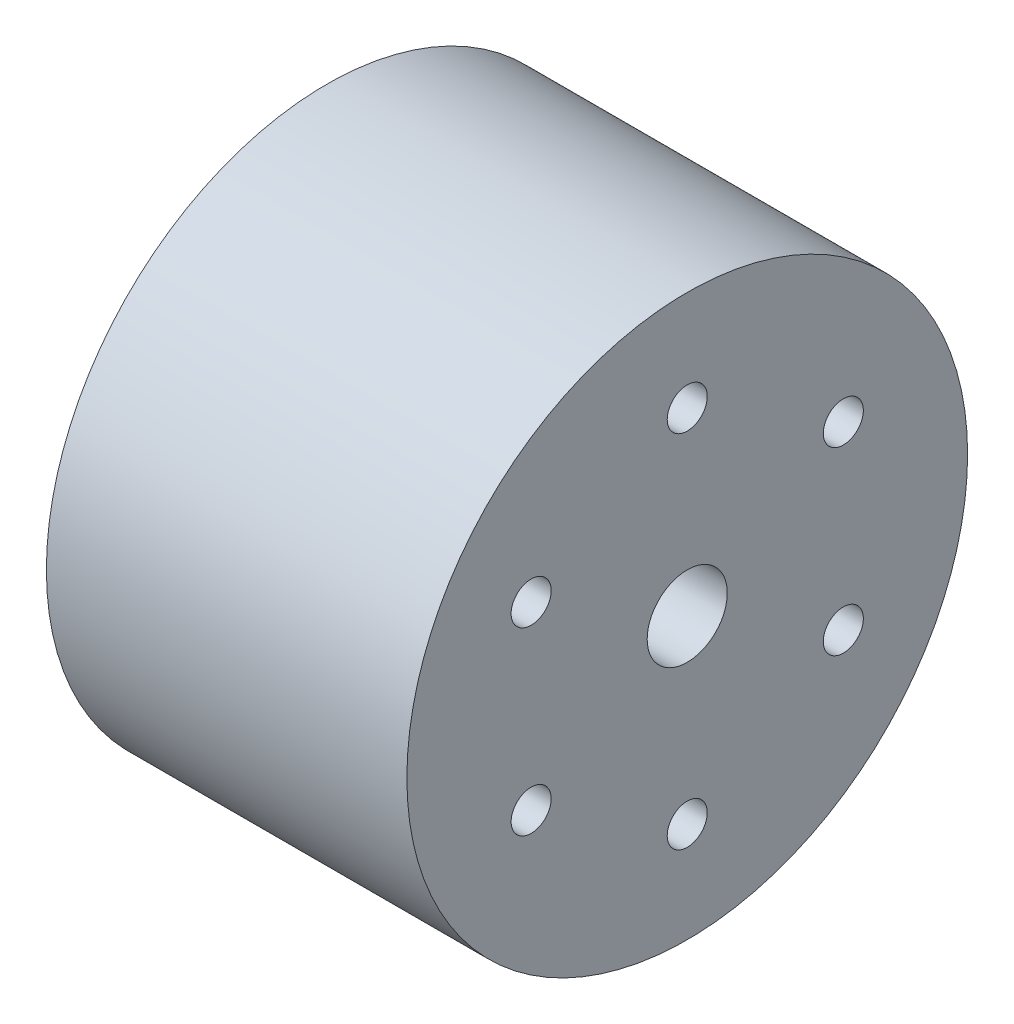
ISO-10303-21;
HEADER;
FILE_DESCRIPTION(('STEP AP214'),'2;1');
FILE_NAME('part.step','',(''),(''),'','','');
FILE_SCHEMA(('AUTOMOTIVE_DESIGN { 1 0 10303 214 1 1 1 1 }'));
ENDSEC;
DATA;
#1=APPLICATION_CONTEXT('core data for automotive mechanical design processes');
#2=APPLICATION_PROTOCOL_DEFINITION('international standard','automotive_design',2000,#1);
#3=PRODUCT_CONTEXT('',#1,'mechanical');
#4=PRODUCT('Part','Part','',(#3));
#5=PRODUCT_RELATED_PRODUCT_CATEGORY('part','',(#4));
#6=PRODUCT_DEFINITION_FORMATION('','',#4);
#7=PRODUCT_DEFINITION_CONTEXT('part definition',#1,'design');
#8=PRODUCT_DEFINITION('design','',#6,#7);
#9=PRODUCT_DEFINITION_SHAPE('','',#8);
#10=(LENGTH_UNIT() NAMED_UNIT(*) SI_UNIT(.MILLI.,.METRE.));
#11=(NAMED_UNIT(*) PLANE_ANGLE_UNIT() SI_UNIT($,.RADIAN.));
#12=(NAMED_UNIT(*) SI_UNIT($,.STERADIAN.) SOLID_ANGLE_UNIT());
#13=UNCERTAINTY_MEASURE_WITH_UNIT(LENGTH_MEASURE(1.E-05),#10,'distance_accuracy_value','');
#14=(GEOMETRIC_REPRESENTATION_CONTEXT(3) GLOBAL_UNCERTAINTY_ASSIGNED_CONTEXT((#13)) GLOBAL_UNIT_ASSIGNED_CONTEXT((#10,
#11,#12)) REPRESENTATION_CONTEXT('',''));
#15=CARTESIAN_POINT('',(0.,0.,0.));
#16=DIRECTION('',(0.,0.,1.));
#17=DIRECTION('',(1.,0.,0.));
#18=AXIS2_PLACEMENT_3D('',#15,#16,#17);
#19=CARTESIAN_POINT('',(0.,0.,0.));
#20=DIRECTION('',(-1.,0.,0.));
#21=DIRECTION('',(0.,0.,1.));
#22=AXIS2_PLACEMENT_3D('',#19,#20,#21);
#23=CYLINDRICAL_SURFACE('',#22,35.);
#24=CARTESIAN_POINT('',(14.45,0.,0.));
#25=DIRECTION('',(-1.,0.,0.));
#26=DIRECTION('',(0.,0.,1.));
#27=AXIS2_PLACEMENT_3D('',#24,#25,#26);
#28=CIRCLE('',#27,35.);
#29=CARTESIAN_POINT('',(14.45,0.,35.));
#30=VERTEX_POINT('',#29);
#31=EDGE_CURVE('E10',#30,#30,#28,.T.);
#32=ORIENTED_EDGE('',*,*,#31,.F.);
#33=EDGE_LOOP('',(#32));
#34=FACE_BOUND('',#33,.T.);
#35=CARTESIAN_POINT('',(59.45,0.,0.));
#36=DIRECTION('',(-1.,0.,0.));
#37=DIRECTION('',(0.,0.,1.));
#38=AXIS2_PLACEMENT_3D('',#35,#36,#37);
#39=CIRCLE('',#38,35.);
#40=CARTESIAN_POINT('',(59.45,0.,35.));
#41=VERTEX_POINT('',#40);
#42=EDGE_CURVE('E55',#41,#41,#39,.T.);
#43=ORIENTED_EDGE('',*,*,#42,.T.);
#44=EDGE_LOOP('',(#43));
#45=FACE_BOUND('',#44,.T.);
#46=ADVANCED_FACE('F33',(#34,#45),#23,.T.);
#47=CARTESIAN_POINT('',(14.45,35.,0.));
#48=DIRECTION('',(1.,0.,0.));
#49=DIRECTION('',(0.,0.,-1.));
#50=AXIS2_PLACEMENT_3D('',#47,#48,#49);
#51=PLANE('',#50);
#52=CARTESIAN_POINT('',(14.45,22.5,-2.65412691824451E-13));
#53=DIRECTION('',(-1.,0.,0.));
#54=DIRECTION('',(0.,0.,1.));
#55=AXIS2_PLACEMENT_3D('',#52,#53,#54);
#56=CIRCLE('',#55,2.5);
#57=CARTESIAN_POINT('',(14.45,22.5,2.49999999999973));
#58=VERTEX_POINT('',#57);
#59=EDGE_CURVE('E69',#58,#58,#56,.T.);
#60=ORIENTED_EDGE('',*,*,#59,.F.);
#61=EDGE_LOOP('',(#60));
#62=FACE_BOUND('',#61,.T.);
#63=CARTESIAN_POINT('',(14.45,11.2499999999998,-19.48557158515));
#64=DIRECTION('',(-1.,0.,0.));
#65=DIRECTION('',(0.,0.,1.));
#66=AXIS2_PLACEMENT_3D('',#63,#64,#65);
#67=CIRCLE('',#66,2.5);
#68=CARTESIAN_POINT('',(14.45,11.2499999999998,-16.98557158515));
#69=VERTEX_POINT('',#68);
#70=EDGE_CURVE('E68',#69,#69,#67,.T.);
#71=ORIENTED_EDGE('',*,*,#70,.F.);
#72=EDGE_LOOP('',(#71));
#73=FACE_BOUND('',#72,.T.);
#74=CARTESIAN_POINT('',(14.45,-11.2500000000002,-19.4855715851497));
#75=DIRECTION('',(-1.,0.,0.));
#76=DIRECTION('',(0.,0.,1.));
#77=AXIS2_PLACEMENT_3D('',#74,#75,#76);
#78=CIRCLE('',#77,2.5);
#79=CARTESIAN_POINT('',(14.45,-11.2500000000002,-16.9855715851497));
#80=VERTEX_POINT('',#79);
#81=EDGE_CURVE('E75',#80,#80,#78,.T.);
#82=ORIENTED_EDGE('',*,*,#81,.F.);
#83=EDGE_LOOP('',(#82));
#84=FACE_BOUND('',#83,.T.);
#85=CARTESIAN_POINT('',(14.45,-22.5,2.55004350968591E-13));
#86=DIRECTION('',(-1.,0.,0.));
#87=DIRECTION('',(0.,0.,1.));
#88=AXIS2_PLACEMENT_3D('',#85,#86,#87);
#89=CIRCLE('',#88,2.5);
#90=CARTESIAN_POINT('',(14.45,-22.5,2.50000000000025));
#91=VERTEX_POINT('',#90);
#92=EDGE_CURVE('E81',#91,#91,#89,.T.);
#93=ORIENTED_EDGE('',*,*,#92,.F.);
#94=EDGE_LOOP('',(#93));
#95=FACE_BOUND('',#94,.T.);
#96=CARTESIAN_POINT('',(14.45,-11.2499999999998,19.48557158515));
#97=DIRECTION('',(-1.,0.,0.));
#98=DIRECTION('',(0.,0.,1.));
#99=AXIS2_PLACEMENT_3D('',#96,#97,#98);
#100=CIRCLE('',#99,2.5);
#101=CARTESIAN_POINT('',(14.45,-11.2499999999998,21.98557158515));
#102=VERTEX_POINT('',#101);
#103=EDGE_CURVE('E87',#102,#102,#100,.T.);
#104=ORIENTED_EDGE('',*,*,#103,.F.);
#105=EDGE_LOOP('',(#104));
#106=FACE_BOUND('',#105,.T.);
#107=CARTESIAN_POINT('',(14.45,11.2500000000002,19.4855715851497));
#108=DIRECTION('',(-1.,0.,0.));
#109=DIRECTION('',(0.,0.,1.));
#110=AXIS2_PLACEMENT_3D('',#107,#108,#109);
#111=CIRCLE('',#110,2.5);
#112=CARTESIAN_POINT('',(14.45,11.2500000000002,21.9855715851497));
#113=VERTEX_POINT('',#112);
#114=EDGE_CURVE('E61',#113,#113,#111,.T.);
#115=ORIENTED_EDGE('',*,*,#114,.F.);
#116=EDGE_LOOP('',(#115));
#117=FACE_BOUND('',#116,.T.);
#118=CARTESIAN_POINT('',(14.45,0.,0.));
#119=DIRECTION('',(-1.,0.,0.));
#120=DIRECTION('',(0.,0.,1.));
#121=AXIS2_PLACEMENT_3D('',#118,#119,#120);
#122=CIRCLE('',#121,16.);
#123=CARTESIAN_POINT('',(14.45,0.,16.));
#124=VERTEX_POINT('',#123);
#125=EDGE_CURVE('E39',#124,#124,#122,.T.);
#126=ORIENTED_EDGE('',*,*,#125,.F.);
#127=EDGE_LOOP('',(#126));
#128=FACE_BOUND('',#127,.T.);
#129=ORIENTED_EDGE('',*,*,#31,.T.);
#130=EDGE_LOOP('',(#129));
#131=FACE_BOUND('',#130,.T.);
#132=ADVANCED_FACE('F97',(#62,#73,#84,#95,#106,#117,#128,#131),#51,.F.);
#133=CARTESIAN_POINT('',(0.,0.,0.));
#134=DIRECTION('',(-1.,0.,0.));
#135=DIRECTION('',(0.,0.,1.));
#136=AXIS2_PLACEMENT_3D('',#133,#134,#135);
#137=CYLINDRICAL_SURFACE('',#136,16.);
#138=CARTESIAN_POINT('',(19.45,0.,0.));
#139=DIRECTION('',(-1.,0.,0.));
#140=DIRECTION('',(0.,0.,1.));
#141=AXIS2_PLACEMENT_3D('',#138,#139,#140);
#142=CIRCLE('',#141,16.);
#143=CARTESIAN_POINT('',(19.45,0.,16.));
#144=VERTEX_POINT('',#143);
#145=EDGE_CURVE('E43',#144,#144,#142,.T.);
#146=ORIENTED_EDGE('',*,*,#145,.F.);
#147=EDGE_LOOP('',(#146));
#148=FACE_BOUND('',#147,.T.);
#149=ORIENTED_EDGE('',*,*,#125,.T.);
#150=EDGE_LOOP('',(#149));
#151=FACE_BOUND('',#150,.T.);
#152=ADVANCED_FACE('F100',(#148,#151),#137,.F.);
#153=CARTESIAN_POINT('',(19.45,16.,0.));
#154=DIRECTION('',(1.,0.,0.));
#155=DIRECTION('',(0.,0.,-1.));
#156=AXIS2_PLACEMENT_3D('',#153,#154,#155);
#157=PLANE('',#156);
#158=CARTESIAN_POINT('',(19.45,0.,0.));
#159=DIRECTION('',(-1.,0.,0.));
#160=DIRECTION('',(0.,0.,1.));
#161=AXIS2_PLACEMENT_3D('',#158,#159,#160);
#162=CIRCLE('',#161,5.);
#163=CARTESIAN_POINT('',(19.45,0.,5.));
#164=VERTEX_POINT('',#163);
#165=EDGE_CURVE('E47',#164,#164,#162,.T.);
#166=ORIENTED_EDGE('',*,*,#165,.F.);
#167=EDGE_LOOP('',(#166));
#168=FACE_BOUND('',#167,.T.);
#169=ORIENTED_EDGE('',*,*,#145,.T.);
#170=EDGE_LOOP('',(#169));
#171=FACE_BOUND('',#170,.T.);
#172=ADVANCED_FACE('F133',(#168,#171),#157,.F.);
#173=CARTESIAN_POINT('',(0.,0.,0.));
#174=DIRECTION('',(-1.,0.,0.));
#175=DIRECTION('',(0.,0.,1.));
#176=AXIS2_PLACEMENT_3D('',#173,#174,#175);
#177=CYLINDRICAL_SURFACE('',#176,5.);
#178=CARTESIAN_POINT('',(59.45,0.,0.));
#179=DIRECTION('',(-1.,0.,0.));
#180=DIRECTION('',(0.,0.,1.));
#181=AXIS2_PLACEMENT_3D('',#178,#179,#180);
#182=CIRCLE('',#181,5.);
#183=CARTESIAN_POINT('',(59.45,0.,5.));
#184=VERTEX_POINT('',#183);
#185=EDGE_CURVE('E52',#184,#184,#182,.T.);
#186=ORIENTED_EDGE('',*,*,#185,.F.);
#187=EDGE_LOOP('',(#186));
#188=FACE_BOUND('',#187,.T.);
#189=ORIENTED_EDGE('',*,*,#165,.T.);
#190=EDGE_LOOP('',(#189));
#191=FACE_BOUND('',#190,.T.);
#192=ADVANCED_FACE('F117',(#188,#191),#177,.F.);
#193=CARTESIAN_POINT('',(59.45,5.,0.));
#194=DIRECTION('',(-1.,0.,0.));
#195=DIRECTION('',(0.,0.,1.));
#196=AXIS2_PLACEMENT_3D('',#193,#194,#195);
#197=PLANE('',#196);
#198=CARTESIAN_POINT('',(59.45,22.5,-2.65412691824451E-13));
#199=DIRECTION('',(-1.,0.,0.));
#200=DIRECTION('',(0.,0.,1.));
#201=AXIS2_PLACEMENT_3D('',#198,#199,#200);
#202=CIRCLE('',#201,2.5);
#203=CARTESIAN_POINT('',(59.45,22.5,2.49999999999973));
#204=VERTEX_POINT('',#203);
#205=EDGE_CURVE('E65',#204,#204,#202,.F.);
#206=ORIENTED_EDGE('',*,*,#205,.F.);
#207=EDGE_LOOP('',(#206));
#208=FACE_BOUND('',#207,.T.);
#209=CARTESIAN_POINT('',(59.45,11.2499999999998,-19.48557158515));
#210=DIRECTION('',(-1.,0.,0.));
#211=DIRECTION('',(0.,0.,1.));
#212=AXIS2_PLACEMENT_3D('',#209,#210,#211);
#213=CIRCLE('',#212,2.5);
#214=CARTESIAN_POINT('',(59.45,11.2499999999998,-16.98557158515));
#215=VERTEX_POINT('',#214);
#216=EDGE_CURVE('E72',#215,#215,#213,.F.);
#217=ORIENTED_EDGE('',*,*,#216,.F.);
#218=EDGE_LOOP('',(#217));
#219=FACE_BOUND('',#218,.T.);
#220=CARTESIAN_POINT('',(59.45,-11.2500000000002,-19.4855715851497));
#221=DIRECTION('',(-1.,0.,0.));
#222=DIRECTION('',(0.,0.,1.));
#223=AXIS2_PLACEMENT_3D('',#220,#221,#222);
#224=CIRCLE('',#223,2.5);
#225=CARTESIAN_POINT('',(59.45,-11.2500000000002,-16.9855715851497));
#226=VERTEX_POINT('',#225);
#227=EDGE_CURVE('E78',#226,#226,#224,.F.);
#228=ORIENTED_EDGE('',*,*,#227,.F.);
#229=EDGE_LOOP('',(#228));
#230=FACE_BOUND('',#229,.T.);
#231=CARTESIAN_POINT('',(59.45,-22.5,2.55004350968591E-13));
#232=DIRECTION('',(-1.,0.,0.));
#233=DIRECTION('',(0.,0.,1.));
#234=AXIS2_PLACEMENT_3D('',#231,#232,#233);
#235=CIRCLE('',#234,2.5);
#236=CARTESIAN_POINT('',(59.45,-22.5,2.50000000000025));
#237=VERTEX_POINT('',#236);
#238=EDGE_CURVE('E84',#237,#237,#235,.F.);
#239=ORIENTED_EDGE('',*,*,#238,.F.);
#240=EDGE_LOOP('',(#239));
#241=FACE_BOUND('',#240,.T.);
#242=CARTESIAN_POINT('',(59.45,-11.2499999999998,19.48557158515));
#243=DIRECTION('',(-1.,0.,0.));
#244=DIRECTION('',(0.,0.,1.));
#245=AXIS2_PLACEMENT_3D('',#242,#243,#244);
#246=CIRCLE('',#245,2.5);
#247=CARTESIAN_POINT('',(59.45,-11.2499999999998,21.98557158515));
#248=VERTEX_POINT('',#247);
#249=EDGE_CURVE('E64',#248,#248,#246,.F.);
#250=ORIENTED_EDGE('',*,*,#249,.F.);
#251=EDGE_LOOP('',(#250));
#252=FACE_BOUND('',#251,.T.);
#253=CARTESIAN_POINT('',(59.45,11.2500000000002,19.4855715851497));
#254=DIRECTION('',(-1.,0.,0.));
#255=DIRECTION('',(0.,0.,1.));
#256=AXIS2_PLACEMENT_3D('',#253,#254,#255);
#257=CIRCLE('',#256,2.5);
#258=CARTESIAN_POINT('',(59.45,11.2500000000002,21.9855715851497));
#259=VERTEX_POINT('',#258);
#260=EDGE_CURVE('E58',#259,#259,#257,.F.);
#261=ORIENTED_EDGE('',*,*,#260,.F.);
#262=EDGE_LOOP('',(#261));
#263=FACE_BOUND('',#262,.T.);
#264=ORIENTED_EDGE('',*,*,#42,.F.);
#265=EDGE_LOOP('',(#264));
#266=FACE_BOUND('',#265,.T.);
#267=ORIENTED_EDGE('',*,*,#185,.T.);
#268=EDGE_LOOP('',(#267));
#269=FACE_BOUND('',#268,.T.);
#270=ADVANCED_FACE('F107',(#208,#219,#230,#241,#252,#263,#266,#269),#197,.F.);
#271=CARTESIAN_POINT('',(66.5210678118655,11.2500000000002,19.4855715851497));
#272=DIRECTION('',(-1.,0.,0.));
#273=DIRECTION('',(0.,0.,1.));
#274=AXIS2_PLACEMENT_3D('',#271,#272,#273);
#275=CYLINDRICAL_SURFACE('',#274,2.5);
#276=ORIENTED_EDGE('',*,*,#260,.T.);
#277=EDGE_LOOP('',(#276));
#278=FACE_BOUND('',#277,.T.);
#279=ORIENTED_EDGE('',*,*,#114,.T.);
#280=EDGE_LOOP('',(#279));
#281=FACE_BOUND('',#280,.T.);
#282=ADVANCED_FACE('F105',(#278,#281),#275,.F.);
#283=CARTESIAN_POINT('',(66.5210678118655,-11.2499999999998,19.48557158515));
#284=DIRECTION('',(-1.,0.,0.));
#285=DIRECTION('',(0.,0.,1.));
#286=AXIS2_PLACEMENT_3D('',#283,#284,#285);
#287=CYLINDRICAL_SURFACE('',#286,2.5);
#288=ORIENTED_EDGE('',*,*,#249,.T.);
#289=EDGE_LOOP('',(#288));
#290=FACE_BOUND('',#289,.T.);
#291=ORIENTED_EDGE('',*,*,#103,.T.);
#292=EDGE_LOOP('',(#291));
#293=FACE_BOUND('',#292,.T.);
#294=ADVANCED_FACE('F95',(#290,#293),#287,.F.);
#295=CARTESIAN_POINT('',(66.5210678118655,-22.5,2.55004350968591E-13));
#296=DIRECTION('',(-1.,0.,0.));
#297=DIRECTION('',(0.,0.,1.));
#298=AXIS2_PLACEMENT_3D('',#295,#296,#297);
#299=CYLINDRICAL_SURFACE('',#298,2.5);
#300=ORIENTED_EDGE('',*,*,#238,.T.);
#301=EDGE_LOOP('',(#300));
#302=FACE_BOUND('',#301,.T.);
#303=ORIENTED_EDGE('',*,*,#92,.T.);
#304=EDGE_LOOP('',(#303));
#305=FACE_BOUND('',#304,.T.);
#306=ADVANCED_FACE('F114',(#302,#305),#299,.F.);
#307=CARTESIAN_POINT('',(66.5210678118655,-11.2500000000002,-19.4855715851497));
#308=DIRECTION('',(-1.,0.,0.));
#309=DIRECTION('',(0.,0.,1.));
#310=AXIS2_PLACEMENT_3D('',#307,#308,#309);
#311=CYLINDRICAL_SURFACE('',#310,2.5);
#312=ORIENTED_EDGE('',*,*,#227,.T.);
#313=EDGE_LOOP('',(#312));
#314=FACE_BOUND('',#313,.T.);
#315=ORIENTED_EDGE('',*,*,#81,.T.);
#316=EDGE_LOOP('',(#315));
#317=FACE_BOUND('',#316,.T.);
#318=ADVANCED_FACE('F181',(#314,#317),#311,.F.);
#319=CARTESIAN_POINT('',(66.5210678118655,11.2499999999998,-19.48557158515));
#320=DIRECTION('',(-1.,0.,0.));
#321=DIRECTION('',(0.,0.,1.));
#322=AXIS2_PLACEMENT_3D('',#319,#320,#321);
#323=CYLINDRICAL_SURFACE('',#322,2.5);
#324=ORIENTED_EDGE('',*,*,#216,.T.);
#325=EDGE_LOOP('',(#324));
#326=FACE_BOUND('',#325,.T.);
#327=ORIENTED_EDGE('',*,*,#70,.T.);
#328=EDGE_LOOP('',(#327));
#329=FACE_BOUND('',#328,.T.);
#330=ADVANCED_FACE('F191',(#326,#329),#323,.F.);
#331=CARTESIAN_POINT('',(66.5210678118655,22.5,-2.65412691824451E-13));
#332=DIRECTION('',(-1.,0.,0.));
#333=DIRECTION('',(0.,0.,1.));
#334=AXIS2_PLACEMENT_3D('',#331,#332,#333);
#335=CYLINDRICAL_SURFACE('',#334,2.5);
#336=ORIENTED_EDGE('',*,*,#205,.T.);
#337=EDGE_LOOP('',(#336));
#338=FACE_BOUND('',#337,.T.);
#339=ORIENTED_EDGE('',*,*,#59,.T.);
#340=EDGE_LOOP('',(#339));
#341=FACE_BOUND('',#340,.T.);
#342=ADVANCED_FACE('F201',(#338,#341),#335,.F.);
#343=CLOSED_SHELL('',(#46,#132,#152,#172,#192,#270,#282,#294,#306,#318,#330,#342));
#344=MANIFOLD_SOLID_BREP('B2',#343);
#345=ADVANCED_BREP_SHAPE_REPRESENTATION('',(#18,#344),#14);
#346=SHAPE_DEFINITION_REPRESENTATION(#9,#345);
ENDSEC;
END-ISO-10303-21;
